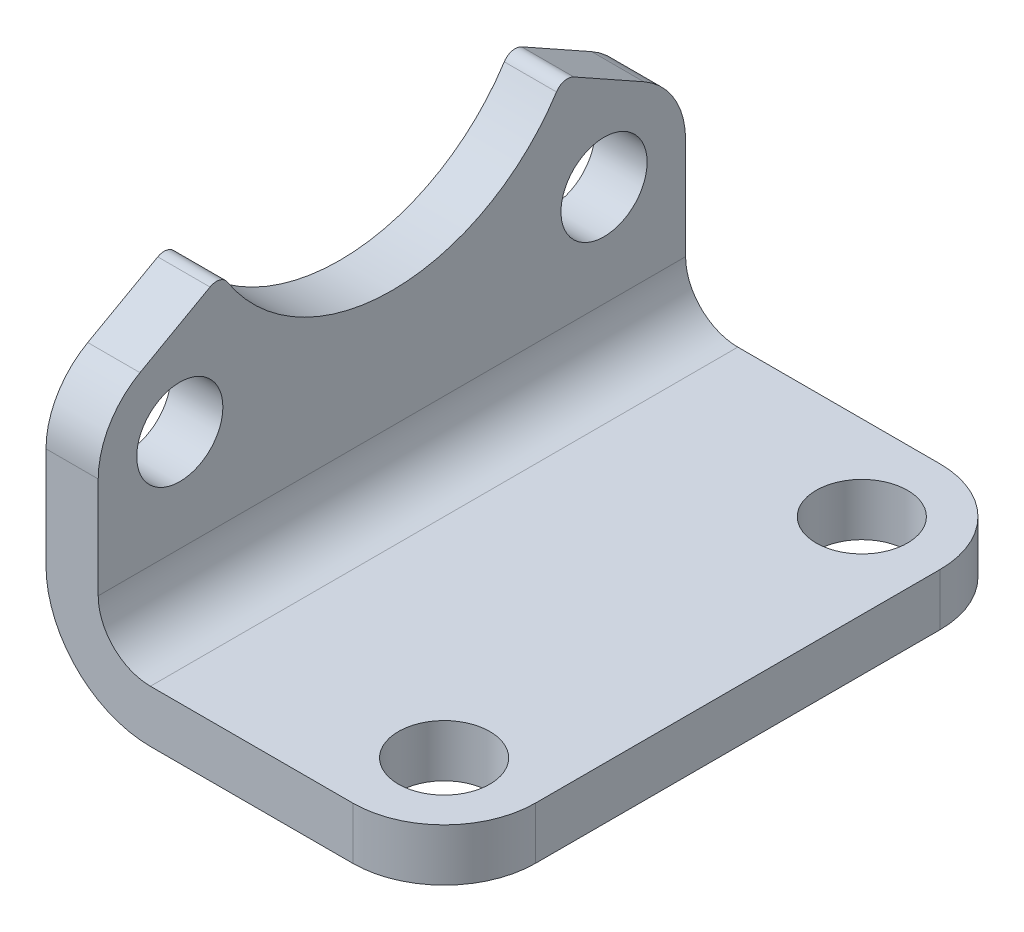
ISO-10303-21;
HEADER;
FILE_DESCRIPTION(('STEP AP214'),'2;1');
FILE_NAME('part.step','',(''),(''),'','','');
FILE_SCHEMA(('AUTOMOTIVE_DESIGN { 1 0 10303 214 1 1 1 1 }'));
ENDSEC;
DATA;
#1=APPLICATION_CONTEXT('core data for automotive mechanical design processes');
#2=APPLICATION_PROTOCOL_DEFINITION('international standard','automotive_design',2000,#1);
#3=PRODUCT_CONTEXT('',#1,'mechanical');
#4=PRODUCT('Part','Part','',(#3));
#5=PRODUCT_RELATED_PRODUCT_CATEGORY('part','',(#4));
#6=PRODUCT_DEFINITION_FORMATION('','',#4);
#7=PRODUCT_DEFINITION_CONTEXT('part definition',#1,'design');
#8=PRODUCT_DEFINITION('design','',#6,#7);
#9=PRODUCT_DEFINITION_SHAPE('','',#8);
#10=(LENGTH_UNIT() NAMED_UNIT(*) SI_UNIT(.MILLI.,.METRE.));
#11=(NAMED_UNIT(*) PLANE_ANGLE_UNIT() SI_UNIT($,.RADIAN.));
#12=(NAMED_UNIT(*) SI_UNIT($,.STERADIAN.) SOLID_ANGLE_UNIT());
#13=UNCERTAINTY_MEASURE_WITH_UNIT(LENGTH_MEASURE(1.E-05),#10,'distance_accuracy_value','');
#14=(GEOMETRIC_REPRESENTATION_CONTEXT(3) GLOBAL_UNCERTAINTY_ASSIGNED_CONTEXT((#13)) GLOBAL_UNIT_ASSIGNED_CONTEXT((#10,
#11,#12)) REPRESENTATION_CONTEXT('',''));
#15=CARTESIAN_POINT('',(0.,0.,0.));
#16=DIRECTION('',(0.,0.,1.));
#17=DIRECTION('',(1.,0.,0.));
#18=AXIS2_PLACEMENT_3D('',#15,#16,#17);
#19=CARTESIAN_POINT('',(5.,-8.66783443079967,-13.4487414385229));
#20=DIRECTION('',(1.,0.,0.));
#21=DIRECTION('',(0.,0.,-1.));
#22=AXIS2_PLACEMENT_3D('',#19,#20,#21);
#23=CYLINDRICAL_SURFACE('',#22,1.);
#24=DIRECTION('',(1.,0.,0.));
#25=VECTOR('',#24,1.);
#26=CARTESIAN_POINT('',(5.,-7.79507266107068,-13.9368878236366));
#27=LINE('',#26,#25);
#28=CARTESIAN_POINT('',(4.,-7.79507266107065,-13.9368878236366));
#29=VERTEX_POINT('',#28);
#30=CARTESIAN_POINT('',(0.,-7.79507266107065,-13.9368878236366));
#31=VERTEX_POINT('',#30);
#32=EDGE_CURVE('E131',#29,#31,#27,.F.);
#33=ORIENTED_EDGE('',*,*,#32,.T.);
#34=CARTESIAN_POINT('',(0.,-8.66783443079967,-13.4487414385229));
#35=DIRECTION('',(1.,0.,0.));
#36=DIRECTION('',(0.,0.,-1.));
#37=AXIS2_PLACEMENT_3D('',#34,#35,#36);
#38=CIRCLE('',#37,1.);
#39=CARTESIAN_POINT('',(0.,-8.1260947546199,-12.6081951142477));
#40=VERTEX_POINT('',#39);
#41=EDGE_CURVE('E136',#31,#40,#38,.T.);
#42=ORIENTED_EDGE('',*,*,#41,.T.);
#43=DIRECTION('',(1.,0.,0.));
#44=VECTOR('',#43,1.);
#45=CARTESIAN_POINT('',(5.,-8.12609473036512,-12.6081951298801));
#46=LINE('',#45,#44);
#47=CARTESIAN_POINT('',(4.,-8.1260947546199,-12.6081951142477));
#48=VERTEX_POINT('',#47);
#49=EDGE_CURVE('E134',#40,#48,#46,.T.);
#50=ORIENTED_EDGE('',*,*,#49,.T.);
#51=CARTESIAN_POINT('',(4.,-8.66783443079967,-13.4487414385229));
#52=DIRECTION('',(1.,0.,0.));
#53=DIRECTION('',(0.,0.,-1.));
#54=AXIS2_PLACEMENT_3D('',#51,#52,#53);
#55=CIRCLE('',#54,1.);
#56=EDGE_CURVE('E19',#48,#29,#55,.F.);
#57=ORIENTED_EDGE('',*,*,#56,.T.);
#58=EDGE_LOOP('',(#33,#42,#50,#57));
#59=FACE_BOUND('',#58,.T.);
#60=ADVANCED_FACE('F16',(#59),#23,.T.);
#61=CARTESIAN_POINT('',(5.,-8.66783443079967,13.4487414385229));
#62=DIRECTION('',(1.,0.,0.));
#63=DIRECTION('',(0.,0.,-1.));
#64=AXIS2_PLACEMENT_3D('',#61,#62,#63);
#65=CYLINDRICAL_SURFACE('',#64,1.);
#66=DIRECTION('',(1.,0.,0.));
#67=VECTOR('',#66,1.);
#68=CARTESIAN_POINT('',(5.,-8.12609477887466,12.6081950986153));
#69=LINE('',#68,#67);
#70=CARTESIAN_POINT('',(4.,-8.12609477887468,12.6081950986152));
#71=VERTEX_POINT('',#70);
#72=CARTESIAN_POINT('',(0.,-8.12609477887468,12.6081950986152));
#73=VERTEX_POINT('',#72);
#74=EDGE_CURVE('E180',#71,#73,#69,.F.);
#75=ORIENTED_EDGE('',*,*,#74,.T.);
#76=CARTESIAN_POINT('',(0.,-8.66783443079967,13.4487414385229));
#77=DIRECTION('',(1.,0.,0.));
#78=DIRECTION('',(0.,0.,-1.));
#79=AXIS2_PLACEMENT_3D('',#76,#77,#78);
#80=CIRCLE('',#79,1.);
#81=CARTESIAN_POINT('',(0.,-7.79507266107064,13.9368878236366));
#82=VERTEX_POINT('',#81);
#83=EDGE_CURVE('E144',#73,#82,#80,.T.);
#84=ORIENTED_EDGE('',*,*,#83,.T.);
#85=DIRECTION('',(1.,0.,0.));
#86=VECTOR('',#85,1.);
#87=CARTESIAN_POINT('',(5.,-7.79507266107066,13.9368878236366));
#88=LINE('',#87,#86);
#89=CARTESIAN_POINT('',(4.,-7.79507266107064,13.9368878236366));
#90=VERTEX_POINT('',#89);
#91=EDGE_CURVE('E177',#82,#90,#88,.T.);
#92=ORIENTED_EDGE('',*,*,#91,.T.);
#93=CARTESIAN_POINT('',(4.,-8.66783443079967,13.4487414385229));
#94=DIRECTION('',(1.,0.,0.));
#95=DIRECTION('',(0.,0.,-1.));
#96=AXIS2_PLACEMENT_3D('',#93,#94,#95);
#97=CIRCLE('',#96,1.);
#98=EDGE_CURVE('E250',#90,#71,#97,.F.);
#99=ORIENTED_EDGE('',*,*,#98,.T.);
#100=EDGE_LOOP('',(#75,#84,#92,#99));
#101=FACE_BOUND('',#100,.T.);
#102=ADVANCED_FACE('F263',(#101),#65,.T.);
#103=CARTESIAN_POINT('',(5.,-16.25,-16.25));
#104=DIRECTION('',(1.,0.,0.));
#105=DIRECTION('',(0.,0.,-1.));
#106=AXIS2_PLACEMENT_3D('',#103,#104,#105);
#107=CYLINDRICAL_SURFACE('',#106,3.3);
#108=CARTESIAN_POINT('',(0.,-16.25,-16.25));
#109=DIRECTION('',(1.,0.,0.));
#110=DIRECTION('',(0.,0.,-1.));
#111=AXIS2_PLACEMENT_3D('',#108,#109,#110);
#112=CIRCLE('',#111,3.3);
#113=CARTESIAN_POINT('',(0.,-16.25,-19.55));
#114=VERTEX_POINT('',#113);
#115=EDGE_CURVE('E239',#114,#114,#112,.F.);
#116=ORIENTED_EDGE('',*,*,#115,.T.);
#117=EDGE_LOOP('',(#116));
#118=FACE_BOUND('',#117,.T.);
#119=CARTESIAN_POINT('',(4.,-16.25,-16.25));
#120=DIRECTION('',(1.,0.,0.));
#121=DIRECTION('',(0.,0.,-1.));
#122=AXIS2_PLACEMENT_3D('',#119,#120,#121);
#123=CIRCLE('',#122,3.3);
#124=CARTESIAN_POINT('',(4.,-16.25,-19.55));
#125=VERTEX_POINT('',#124);
#126=EDGE_CURVE('E165',#125,#125,#123,.T.);
#127=ORIENTED_EDGE('',*,*,#126,.T.);
#128=EDGE_LOOP('',(#127));
#129=FACE_BOUND('',#128,.T.);
#130=ADVANCED_FACE('F392',(#118,#129),#107,.F.);
#131=CARTESIAN_POINT('',(5.,-16.25,16.25));
#132=DIRECTION('',(1.,0.,0.));
#133=DIRECTION('',(0.,0.,-1.));
#134=AXIS2_PLACEMENT_3D('',#131,#132,#133);
#135=CYLINDRICAL_SURFACE('',#134,3.3);
#136=CARTESIAN_POINT('',(0.,-16.25,16.25));
#137=DIRECTION('',(1.,0.,0.));
#138=DIRECTION('',(0.,0.,-1.));
#139=AXIS2_PLACEMENT_3D('',#136,#137,#138);
#140=CIRCLE('',#139,3.3);
#141=CARTESIAN_POINT('',(0.,-16.25,12.95));
#142=VERTEX_POINT('',#141);
#143=EDGE_CURVE('E236',#142,#142,#140,.F.);
#144=ORIENTED_EDGE('',*,*,#143,.T.);
#145=EDGE_LOOP('',(#144));
#146=FACE_BOUND('',#145,.T.);
#147=CARTESIAN_POINT('',(4.,-16.25,16.25));
#148=DIRECTION('',(1.,0.,0.));
#149=DIRECTION('',(0.,0.,-1.));
#150=AXIS2_PLACEMENT_3D('',#147,#148,#149);
#151=CIRCLE('',#150,3.3);
#152=CARTESIAN_POINT('',(4.,-16.25,12.95));
#153=VERTEX_POINT('',#152);
#154=EDGE_CURVE('E156',#153,#153,#151,.T.);
#155=ORIENTED_EDGE('',*,*,#154,.T.);
#156=EDGE_LOOP('',(#155));
#157=FACE_BOUND('',#156,.T.);
#158=ADVANCED_FACE('F389',(#146,#157),#135,.F.);
#159=CARTESIAN_POINT('',(5.,-10.7952389391937,-19.3009149069601));
#160=DIRECTION('',(0.,-0.872761769729005,0.488146385113621));
#161=DIRECTION('',(0.,-0.488146385113621,-0.872761769729005));
#162=AXIS2_PLACEMENT_3D('',#159,#160,#161);
#163=PLANE('',#162);
#164=DIRECTION('',(0.,-0.488146385113624,-0.872761769729003));
#165=VECTOR('',#164,1.);
#166=CARTESIAN_POINT('',(4.,-7.79507266107066,-13.9368878236366));
#167=LINE('',#166,#165);
#168=CARTESIAN_POINT('',(4.,-10.7952389391937,-19.3009149069601));
#169=VERTEX_POINT('',#168);
#170=EDGE_CURVE('E140',#29,#169,#167,.T.);
#171=ORIENTED_EDGE('',*,*,#170,.T.);
#172=DIRECTION('',(1.,0.,0.));
#173=VECTOR('',#172,1.);
#174=CARTESIAN_POINT('',(5.,-10.7952389391937,-19.3009149069601));
#175=LINE('',#174,#173);
#176=CARTESIAN_POINT('',(0.,-10.7952389391937,-19.3009149069601));
#177=VERTEX_POINT('',#176);
#178=EDGE_CURVE('E184',#177,#169,#175,.T.);
#179=ORIENTED_EDGE('',*,*,#178,.F.);
#180=DIRECTION('',(0.,0.488146385113624,0.872761769729003));
#181=VECTOR('',#180,1.);
#182=CARTESIAN_POINT('',(0.,-10.7952389391937,-19.3009149069601));
#183=LINE('',#182,#181);
#184=EDGE_CURVE('E143',#177,#31,#183,.T.);
#185=ORIENTED_EDGE('',*,*,#184,.T.);
#186=ORIENTED_EDGE('',*,*,#32,.F.);
#187=EDGE_LOOP('',(#171,#179,#185,#186));
#188=FACE_BOUND('',#187,.T.);
#189=ADVANCED_FACE('F139',(#188),#163,.F.);
#190=CARTESIAN_POINT('',(5.,0.,0.));
#191=DIRECTION('',(1.,0.,0.));
#192=DIRECTION('',(0.,0.,-1.));
#193=AXIS2_PLACEMENT_3D('',#190,#191,#192);
#194=CYLINDRICAL_SURFACE('',#193,15.);
#195=ORIENTED_EDGE('',*,*,#74,.F.);
#196=CARTESIAN_POINT('',(4.,0.,0.));
#197=DIRECTION('',(1.,0.,0.));
#198=DIRECTION('',(0.,0.,-1.));
#199=AXIS2_PLACEMENT_3D('',#196,#197,#198);
#200=CIRCLE('',#199,15.);
#201=EDGE_CURVE('E151',#71,#48,#200,.T.);
#202=ORIENTED_EDGE('',*,*,#201,.T.);
#203=ORIENTED_EDGE('',*,*,#49,.F.);
#204=CARTESIAN_POINT('',(0.,0.,0.));
#205=DIRECTION('',(1.,0.,0.));
#206=DIRECTION('',(0.,0.,-1.));
#207=AXIS2_PLACEMENT_3D('',#204,#205,#206);
#208=CIRCLE('',#207,15.);
#209=EDGE_CURVE('E230',#40,#73,#208,.F.);
#210=ORIENTED_EDGE('',*,*,#209,.T.);
#211=EDGE_LOOP('',(#195,#202,#203,#210));
#212=FACE_BOUND('',#211,.T.);
#213=ADVANCED_FACE('F255',(#212),#194,.F.);
#214=CARTESIAN_POINT('',(5.,-7.79507266107066,13.9368878236366));
#215=DIRECTION('',(0.,-0.872761769729005,-0.488146385113621));
#216=DIRECTION('',(0.,0.488146385113621,-0.872761769729005));
#217=AXIS2_PLACEMENT_3D('',#214,#215,#216);
#218=PLANE('',#217);
#219=DIRECTION('',(0.,0.488146385113624,-0.872761769729003));
#220=VECTOR('',#219,1.);
#221=CARTESIAN_POINT('',(4.,-10.7952389391937,19.3009149069601));
#222=LINE('',#221,#220);
#223=CARTESIAN_POINT('',(4.,-10.7952389391937,19.3009149069601));
#224=VERTEX_POINT('',#223);
#225=EDGE_CURVE('E159',#224,#90,#222,.T.);
#226=ORIENTED_EDGE('',*,*,#225,.T.);
#227=ORIENTED_EDGE('',*,*,#91,.F.);
#228=DIRECTION('',(0.,-0.488146385113624,0.872761769729003));
#229=VECTOR('',#228,1.);
#230=CARTESIAN_POINT('',(0.,-7.79507266107066,13.9368878236366));
#231=LINE('',#230,#229);
#232=CARTESIAN_POINT('',(0.,-10.7952389391937,19.3009149069601));
#233=VERTEX_POINT('',#232);
#234=EDGE_CURVE('E229',#82,#233,#231,.T.);
#235=ORIENTED_EDGE('',*,*,#234,.T.);
#236=DIRECTION('',(1.,0.,0.));
#237=VECTOR('',#236,1.);
#238=CARTESIAN_POINT('',(5.,-10.7952389391937,19.3009149069601));
#239=LINE('',#238,#237);
#240=EDGE_CURVE('E166',#224,#233,#239,.F.);
#241=ORIENTED_EDGE('',*,*,#240,.F.);
#242=EDGE_LOOP('',(#226,#227,#235,#241));
#243=FACE_BOUND('',#242,.T.);
#244=ADVANCED_FACE('F267',(#243),#218,.F.);
#245=CARTESIAN_POINT('',(5.,-16.25,16.25));
#246=DIRECTION('',(1.,0.,0.));
#247=DIRECTION('',(0.,0.,-1.));
#248=AXIS2_PLACEMENT_3D('',#245,#246,#247);
#249=CYLINDRICAL_SURFACE('',#248,6.24999999999999);
#250=ORIENTED_EDGE('',*,*,#240,.T.);
#251=CARTESIAN_POINT('',(0.,-16.25,16.25));
#252=DIRECTION('',(1.,0.,0.));
#253=DIRECTION('',(0.,0.,-1.));
#254=AXIS2_PLACEMENT_3D('',#251,#252,#253);
#255=CIRCLE('',#254,6.24999999999999);
#256=CARTESIAN_POINT('',(0.,-16.25,22.5));
#257=VERTEX_POINT('',#256);
#258=EDGE_CURVE('E226',#233,#257,#255,.T.);
#259=ORIENTED_EDGE('',*,*,#258,.T.);
#260=DIRECTION('',(1.,0.,0.));
#261=VECTOR('',#260,1.);
#262=CARTESIAN_POINT('',(8.,-16.25,22.5));
#263=LINE('',#262,#261);
#264=CARTESIAN_POINT('',(4.,-16.25,22.5));
#265=VERTEX_POINT('',#264);
#266=EDGE_CURVE('E172',#265,#257,#263,.F.);
#267=ORIENTED_EDGE('',*,*,#266,.F.);
#268=CARTESIAN_POINT('',(4.,-16.25,16.25));
#269=DIRECTION('',(1.,0.,0.));
#270=DIRECTION('',(0.,0.,-1.));
#271=AXIS2_PLACEMENT_3D('',#268,#269,#270);
#272=CIRCLE('',#271,6.24999999999999);
#273=EDGE_CURVE('E154',#265,#224,#272,.F.);
#274=ORIENTED_EDGE('',*,*,#273,.T.);
#275=EDGE_LOOP('',(#250,#259,#267,#274));
#276=FACE_BOUND('',#275,.T.);
#277=ADVANCED_FACE('F269',(#276),#249,.T.);
#278=CARTESIAN_POINT('',(30.5,-28.,22.5));
#279=DIRECTION('',(0.,-1.,0.));
#280=DIRECTION('',(0.,0.,-1.));
#281=AXIS2_PLACEMENT_3D('',#278,#279,#280);
#282=PLANE('',#281);
#283=CARTESIAN_POINT('',(23.5,-28.,-15.5));
#284=DIRECTION('',(0.,1.,0.));
#285=DIRECTION('',(0.,0.,1.));
#286=AXIS2_PLACEMENT_3D('',#283,#284,#285);
#287=CIRCLE('',#286,7.00000000000001);
#288=CARTESIAN_POINT('',(23.5,-28.,-22.5));
#289=VERTEX_POINT('',#288);
#290=CARTESIAN_POINT('',(30.5,-28.,-15.500000052154));
#291=VERTEX_POINT('',#290);
#292=EDGE_CURVE('E170',#289,#291,#287,.F.);
#293=ORIENTED_EDGE('',*,*,#292,.F.);
#294=DIRECTION('',(1.,0.,0.));
#295=VECTOR('',#294,1.);
#296=CARTESIAN_POINT('',(8.,-28.,-22.5));
#297=LINE('',#296,#295);
#298=CARTESIAN_POINT('',(8.,-28.,-22.5));
#299=VERTEX_POINT('',#298);
#300=EDGE_CURVE('E208',#289,#299,#297,.F.);
#301=ORIENTED_EDGE('',*,*,#300,.T.);
#302=DIRECTION('',(0.,0.,1.));
#303=VECTOR('',#302,1.);
#304=CARTESIAN_POINT('',(8.,-28.,22.5));
#305=LINE('',#304,#303);
#306=CARTESIAN_POINT('',(8.,-28.,22.5));
#307=VERTEX_POINT('',#306);
#308=EDGE_CURVE('E162',#299,#307,#305,.T.);
#309=ORIENTED_EDGE('',*,*,#308,.T.);
#310=DIRECTION('',(1.,0.,0.));
#311=VECTOR('',#310,1.);
#312=CARTESIAN_POINT('',(8.,-28.,22.5));
#313=LINE('',#312,#311);
#314=CARTESIAN_POINT('',(23.5,-28.,22.5));
#315=VERTEX_POINT('',#314);
#316=EDGE_CURVE('E218',#315,#307,#313,.F.);
#317=ORIENTED_EDGE('',*,*,#316,.F.);
#318=CARTESIAN_POINT('',(23.5,-28.,15.5));
#319=DIRECTION('',(0.,1.,0.));
#320=DIRECTION('',(0.,0.,1.));
#321=AXIS2_PLACEMENT_3D('',#318,#319,#320);
#322=CIRCLE('',#321,7.00000000000001);
#323=CARTESIAN_POINT('',(30.5,-28.,15.5));
#324=VERTEX_POINT('',#323);
#325=EDGE_CURVE('E211',#324,#315,#322,.F.);
#326=ORIENTED_EDGE('',*,*,#325,.F.);
#327=DIRECTION('',(0.,0.,1.));
#328=VECTOR('',#327,1.);
#329=CARTESIAN_POINT('',(30.5,-28.,22.5));
#330=LINE('',#329,#328);
#331=EDGE_CURVE('E167',#324,#291,#330,.F.);
#332=ORIENTED_EDGE('',*,*,#331,.T.);
#333=EDGE_LOOP('',(#293,#301,#309,#317,#326,#332));
#334=FACE_BOUND('',#333,.T.);
#335=CARTESIAN_POINT('',(24.,-28.,-16.));
#336=DIRECTION('',(0.,1.,0.));
#337=DIRECTION('',(0.,0.,1.));
#338=AXIS2_PLACEMENT_3D('',#335,#336,#337);
#339=CIRCLE('',#338,3.5);
#340=CARTESIAN_POINT('',(24.,-28.,-12.5));
#341=VERTEX_POINT('',#340);
#342=EDGE_CURVE('E219',#341,#341,#339,.F.);
#343=ORIENTED_EDGE('',*,*,#342,.T.);
#344=EDGE_LOOP('',(#343));
#345=FACE_BOUND('',#344,.T.);
#346=CARTESIAN_POINT('',(24.,-28.,16.));
#347=DIRECTION('',(0.,1.,0.));
#348=DIRECTION('',(0.,0.,1.));
#349=AXIS2_PLACEMENT_3D('',#346,#347,#348);
#350=CIRCLE('',#349,3.5);
#351=CARTESIAN_POINT('',(24.,-28.,19.5));
#352=VERTEX_POINT('',#351);
#353=EDGE_CURVE('E223',#352,#352,#350,.F.);
#354=ORIENTED_EDGE('',*,*,#353,.T.);
#355=EDGE_LOOP('',(#354));
#356=FACE_BOUND('',#355,.T.);
#357=ADVANCED_FACE('F320',(#334,#345,#356),#282,.F.);
#358=CARTESIAN_POINT('',(8.,-24.,22.5));
#359=DIRECTION('',(0.,0.,1.));
#360=DIRECTION('',(1.,0.,0.));
#361=AXIS2_PLACEMENT_3D('',#358,#359,#360);
#362=CYLINDRICAL_SURFACE('',#361,4.);
#363=DIRECTION('',(0.,0.,1.));
#364=VECTOR('',#363,1.);
#365=CARTESIAN_POINT('',(4.,-24.,22.5));
#366=LINE('',#365,#364);
#367=CARTESIAN_POINT('',(4.,-24.,-22.5));
#368=VERTEX_POINT('',#367);
#369=CARTESIAN_POINT('',(4.,-24.,22.5));
#370=VERTEX_POINT('',#369);
#371=EDGE_CURVE('E150',#368,#370,#366,.T.);
#372=ORIENTED_EDGE('',*,*,#371,.T.);
#373=CARTESIAN_POINT('',(8.,-24.,22.5));
#374=DIRECTION('',(0.,0.,1.));
#375=DIRECTION('',(1.,0.,0.));
#376=AXIS2_PLACEMENT_3D('',#373,#374,#375);
#377=CIRCLE('',#376,4.);
#378=EDGE_CURVE('E216',#307,#370,#377,.F.);
#379=ORIENTED_EDGE('',*,*,#378,.F.);
#380=ORIENTED_EDGE('',*,*,#308,.F.);
#381=CARTESIAN_POINT('',(8.,-24.,-22.5));
#382=DIRECTION('',(0.,0.,1.));
#383=DIRECTION('',(1.,0.,0.));
#384=AXIS2_PLACEMENT_3D('',#381,#382,#383);
#385=CIRCLE('',#384,4.);
#386=EDGE_CURVE('E204',#299,#368,#385,.F.);
#387=ORIENTED_EDGE('',*,*,#386,.T.);
#388=EDGE_LOOP('',(#372,#379,#380,#387));
#389=FACE_BOUND('',#388,.T.);
#390=ADVANCED_FACE('F325',(#389),#362,.F.);
#391=CARTESIAN_POINT('',(4.,-24.,22.5));
#392=DIRECTION('',(-1.,0.,0.));
#393=DIRECTION('',(0.,0.,1.));
#394=AXIS2_PLACEMENT_3D('',#391,#392,#393);
#395=PLANE('',#394);
#396=ORIENTED_EDGE('',*,*,#273,.F.);
#397=DIRECTION('',(0.,1.,0.));
#398=VECTOR('',#397,1.);
#399=CARTESIAN_POINT('',(4.,-24.,22.5));
#400=LINE('',#399,#398);
#401=EDGE_CURVE('E175',#370,#265,#400,.T.);
#402=ORIENTED_EDGE('',*,*,#401,.F.);
#403=ORIENTED_EDGE('',*,*,#371,.F.);
#404=DIRECTION('',(0.,1.,0.));
#405=VECTOR('',#404,1.);
#406=CARTESIAN_POINT('',(4.,-24.,-22.5));
#407=LINE('',#406,#405);
#408=CARTESIAN_POINT('',(4.,-16.25,-22.5));
#409=VERTEX_POINT('',#408);
#410=EDGE_CURVE('E207',#368,#409,#407,.T.);
#411=ORIENTED_EDGE('',*,*,#410,.T.);
#412=CARTESIAN_POINT('',(4.,-16.25,-16.25));
#413=DIRECTION('',(1.,0.,0.));
#414=DIRECTION('',(0.,0.,-1.));
#415=AXIS2_PLACEMENT_3D('',#412,#413,#414);
#416=CIRCLE('',#415,6.24999999999999);
#417=EDGE_CURVE('E149',#169,#409,#416,.F.);
#418=ORIENTED_EDGE('',*,*,#417,.F.);
#419=ORIENTED_EDGE('',*,*,#170,.F.);
#420=ORIENTED_EDGE('',*,*,#56,.F.);
#421=ORIENTED_EDGE('',*,*,#201,.F.);
#422=ORIENTED_EDGE('',*,*,#98,.F.);
#423=ORIENTED_EDGE('',*,*,#225,.F.);
#424=EDGE_LOOP('',(#396,#402,#403,#411,#418,#419,#420,#421,#422,#423));
#425=FACE_BOUND('',#424,.T.);
#426=ORIENTED_EDGE('',*,*,#154,.F.);
#427=EDGE_LOOP('',(#426));
#428=FACE_BOUND('',#427,.T.);
#429=ORIENTED_EDGE('',*,*,#126,.F.);
#430=EDGE_LOOP('',(#429));
#431=FACE_BOUND('',#430,.T.);
#432=ADVANCED_FACE('F146',(#425,#428,#431),#395,.F.);
#433=CARTESIAN_POINT('',(5.,-16.25,-16.25));
#434=DIRECTION('',(1.,0.,0.));
#435=DIRECTION('',(0.,0.,-1.));
#436=AXIS2_PLACEMENT_3D('',#433,#434,#435);
#437=CYLINDRICAL_SURFACE('',#436,6.24999999999999);
#438=DIRECTION('',(1.,0.,0.));
#439=VECTOR('',#438,1.);
#440=CARTESIAN_POINT('',(8.,-16.25,-22.5));
#441=LINE('',#440,#439);
#442=CARTESIAN_POINT('',(0.,-16.25,-22.5));
#443=VERTEX_POINT('',#442);
#444=EDGE_CURVE('E285',#409,#443,#441,.F.);
#445=ORIENTED_EDGE('',*,*,#444,.T.);
#446=CARTESIAN_POINT('',(0.,-16.25,-16.25));
#447=DIRECTION('',(1.,0.,0.));
#448=DIRECTION('',(0.,0.,-1.));
#449=AXIS2_PLACEMENT_3D('',#446,#447,#448);
#450=CIRCLE('',#449,6.24999999999999);
#451=EDGE_CURVE('E233',#443,#177,#450,.T.);
#452=ORIENTED_EDGE('',*,*,#451,.T.);
#453=ORIENTED_EDGE('',*,*,#178,.T.);
#454=ORIENTED_EDGE('',*,*,#417,.T.);
#455=EDGE_LOOP('',(#445,#452,#453,#454));
#456=FACE_BOUND('',#455,.T.);
#457=ADVANCED_FACE('F330',(#456),#437,.T.);
#458=CARTESIAN_POINT('',(0.,-1.,22.5));
#459=DIRECTION('',(1.,0.,0.));
#460=DIRECTION('',(0.,0.,-1.));
#461=AXIS2_PLACEMENT_3D('',#458,#459,#460);
#462=PLANE('',#461);
#463=ORIENTED_EDGE('',*,*,#258,.F.);
#464=ORIENTED_EDGE('',*,*,#234,.F.);
#465=ORIENTED_EDGE('',*,*,#83,.F.);
#466=ORIENTED_EDGE('',*,*,#209,.F.);
#467=ORIENTED_EDGE('',*,*,#41,.F.);
#468=ORIENTED_EDGE('',*,*,#184,.F.);
#469=ORIENTED_EDGE('',*,*,#451,.F.);
#470=DIRECTION('',(0.,1.,0.));
#471=VECTOR('',#470,1.);
#472=CARTESIAN_POINT('',(0.,-24.,-22.5));
#473=LINE('',#472,#471);
#474=CARTESIAN_POINT('',(0.,-24.,-22.5));
#475=VERTEX_POINT('',#474);
#476=EDGE_CURVE('E203',#443,#475,#473,.F.);
#477=ORIENTED_EDGE('',*,*,#476,.T.);
#478=DIRECTION('',(0.,0.,1.));
#479=VECTOR('',#478,1.);
#480=CARTESIAN_POINT('',(0.,-24.,22.5));
#481=LINE('',#480,#479);
#482=CARTESIAN_POINT('',(0.,-24.,22.5));
#483=VERTEX_POINT('',#482);
#484=EDGE_CURVE('E222',#483,#475,#481,.F.);
#485=ORIENTED_EDGE('',*,*,#484,.F.);
#486=DIRECTION('',(0.,1.,0.));
#487=VECTOR('',#486,1.);
#488=CARTESIAN_POINT('',(0.,-24.,22.5));
#489=LINE('',#488,#487);
#490=EDGE_CURVE('E174',#257,#483,#489,.F.);
#491=ORIENTED_EDGE('',*,*,#490,.F.);
#492=EDGE_LOOP('',(#463,#464,#465,#466,#467,#468,#469,#477,#485,#491));
#493=FACE_BOUND('',#492,.T.);
#494=ORIENTED_EDGE('',*,*,#143,.F.);
#495=EDGE_LOOP('',(#494));
#496=FACE_BOUND('',#495,.T.);
#497=ORIENTED_EDGE('',*,*,#115,.F.);
#498=EDGE_LOOP('',(#497));
#499=FACE_BOUND('',#498,.T.);
#500=ADVANCED_FACE('F257',(#493,#496,#499),#462,.F.);
#501=CARTESIAN_POINT('',(24.,33.,16.));
#502=DIRECTION('',(0.,1.,0.));
#503=DIRECTION('',(0.,0.,1.));
#504=AXIS2_PLACEMENT_3D('',#501,#502,#503);
#505=CYLINDRICAL_SURFACE('',#504,3.5);
#506=CARTESIAN_POINT('',(24.,-32.,16.));
#507=DIRECTION('',(0.,1.,0.));
#508=DIRECTION('',(0.,0.,1.));
#509=AXIS2_PLACEMENT_3D('',#506,#507,#508);
#510=CIRCLE('',#509,3.5);
#511=CARTESIAN_POINT('',(24.,-32.,19.5));
#512=VERTEX_POINT('',#511);
#513=EDGE_CURVE('E197',#512,#512,#510,.F.);
#514=ORIENTED_EDGE('',*,*,#513,.T.);
#515=EDGE_LOOP('',(#514));
#516=FACE_BOUND('',#515,.T.);
#517=ORIENTED_EDGE('',*,*,#353,.F.);
#518=EDGE_LOOP('',(#517));
#519=FACE_BOUND('',#518,.T.);
#520=ADVANCED_FACE('F338',(#516,#519),#505,.F.);
#521=CARTESIAN_POINT('',(24.,33.,-16.));
#522=DIRECTION('',(0.,1.,0.));
#523=DIRECTION('',(0.,0.,1.));
#524=AXIS2_PLACEMENT_3D('',#521,#522,#523);
#525=CYLINDRICAL_SURFACE('',#524,3.5);
#526=CARTESIAN_POINT('',(24.,-32.,-16.));
#527=DIRECTION('',(0.,1.,0.));
#528=DIRECTION('',(0.,0.,1.));
#529=AXIS2_PLACEMENT_3D('',#526,#527,#528);
#530=CIRCLE('',#529,3.5);
#531=CARTESIAN_POINT('',(24.,-32.,-12.5));
#532=VERTEX_POINT('',#531);
#533=EDGE_CURVE('E193',#532,#532,#530,.F.);
#534=ORIENTED_EDGE('',*,*,#533,.T.);
#535=EDGE_LOOP('',(#534));
#536=FACE_BOUND('',#535,.T.);
#537=ORIENTED_EDGE('',*,*,#342,.F.);
#538=EDGE_LOOP('',(#537));
#539=FACE_BOUND('',#538,.T.);
#540=ADVANCED_FACE('F361',(#536,#539),#525,.F.);
#541=CARTESIAN_POINT('',(8.,-24.,22.5));
#542=DIRECTION('',(0.,0.,1.));
#543=DIRECTION('',(1.,0.,0.));
#544=AXIS2_PLACEMENT_3D('',#541,#542,#543);
#545=CYLINDRICAL_SURFACE('',#544,8.);
#546=CARTESIAN_POINT('',(8.,-24.,22.5));
#547=DIRECTION('',(0.,0.,1.));
#548=DIRECTION('',(1.,0.,0.));
#549=AXIS2_PLACEMENT_3D('',#546,#547,#548);
#550=CIRCLE('',#549,8.);
#551=CARTESIAN_POINT('',(7.99999999999999,-32.,22.5));
#552=VERTEX_POINT('',#551);
#553=EDGE_CURVE('E214',#483,#552,#550,.T.);
#554=ORIENTED_EDGE('',*,*,#553,.F.);
#555=ORIENTED_EDGE('',*,*,#484,.T.);
#556=CARTESIAN_POINT('',(8.,-24.,-22.5));
#557=DIRECTION('',(0.,0.,1.));
#558=DIRECTION('',(1.,0.,0.));
#559=AXIS2_PLACEMENT_3D('',#556,#557,#558);
#560=CIRCLE('',#559,8.);
#561=CARTESIAN_POINT('',(7.99999999999999,-32.,-22.5));
#562=VERTEX_POINT('',#561);
#563=EDGE_CURVE('E200',#475,#562,#560,.T.);
#564=ORIENTED_EDGE('',*,*,#563,.T.);
#565=DIRECTION('',(0.,0.,1.));
#566=VECTOR('',#565,1.);
#567=CARTESIAN_POINT('',(7.99999999999999,-32.,22.5));
#568=LINE('',#567,#566);
#569=EDGE_CURVE('E196',#562,#552,#568,.T.);
#570=ORIENTED_EDGE('',*,*,#569,.T.);
#571=EDGE_LOOP('',(#554,#555,#564,#570));
#572=FACE_BOUND('',#571,.T.);
#573=ADVANCED_FACE('F358',(#572),#545,.T.);
#574=CARTESIAN_POINT('',(8.,-24.,22.5));
#575=DIRECTION('',(0.,0.,1.));
#576=DIRECTION('',(1.,0.,0.));
#577=AXIS2_PLACEMENT_3D('',#574,#575,#576);
#578=PLANE('',#577);
#579=DIRECTION('',(1.,0.,0.));
#580=VECTOR('',#579,1.);
#581=CARTESIAN_POINT('',(8.,-32.,22.5));
#582=LINE('',#581,#580);
#583=CARTESIAN_POINT('',(23.5,-32.,22.5));
#584=VERTEX_POINT('',#583);
#585=EDGE_CURVE('E192',#552,#584,#582,.T.);
#586=ORIENTED_EDGE('',*,*,#585,.T.);
#587=DIRECTION('',(0.,1.,0.));
#588=VECTOR('',#587,1.);
#589=CARTESIAN_POINT('',(23.5,33.,22.5));
#590=LINE('',#589,#588);
#591=EDGE_CURVE('E213',#315,#584,#590,.F.);
#592=ORIENTED_EDGE('',*,*,#591,.F.);
#593=ORIENTED_EDGE('',*,*,#316,.T.);
#594=ORIENTED_EDGE('',*,*,#378,.T.);
#595=ORIENTED_EDGE('',*,*,#401,.T.);
#596=ORIENTED_EDGE('',*,*,#266,.T.);
#597=ORIENTED_EDGE('',*,*,#490,.T.);
#598=ORIENTED_EDGE('',*,*,#553,.T.);
#599=EDGE_LOOP('',(#586,#592,#593,#594,#595,#596,#597,#598));
#600=FACE_BOUND('',#599,.T.);
#601=ADVANCED_FACE('F313',(#600),#578,.T.);
#602=CARTESIAN_POINT('',(23.5,33.,15.5));
#603=DIRECTION('',(0.,1.,0.));
#604=DIRECTION('',(0.,0.,1.));
#605=AXIS2_PLACEMENT_3D('',#602,#603,#604);
#606=CYLINDRICAL_SURFACE('',#605,7.00000000000001);
#607=ORIENTED_EDGE('',*,*,#591,.T.);
#608=CARTESIAN_POINT('',(23.5,-32.,15.5));
#609=DIRECTION('',(0.,1.,0.));
#610=DIRECTION('',(0.,0.,1.));
#611=AXIS2_PLACEMENT_3D('',#608,#609,#610);
#612=CIRCLE('',#611,7.00000000000001);
#613=CARTESIAN_POINT('',(30.5,-32.,15.5));
#614=VERTEX_POINT('',#613);
#615=EDGE_CURVE('E189',#584,#614,#612,.T.);
#616=ORIENTED_EDGE('',*,*,#615,.T.);
#617=DIRECTION('',(0.,1.,0.));
#618=VECTOR('',#617,1.);
#619=CARTESIAN_POINT('',(30.5,-32.,15.5));
#620=LINE('',#619,#618);
#621=EDGE_CURVE('E171',#614,#324,#620,.T.);
#622=ORIENTED_EDGE('',*,*,#621,.T.);
#623=ORIENTED_EDGE('',*,*,#325,.T.);
#624=EDGE_LOOP('',(#607,#616,#622,#623));
#625=FACE_BOUND('',#624,.T.);
#626=ADVANCED_FACE('F303',(#625),#606,.T.);
#627=CARTESIAN_POINT('',(30.5,-32.,22.5));
#628=DIRECTION('',(-1.,0.,0.));
#629=DIRECTION('',(0.,0.,1.));
#630=AXIS2_PLACEMENT_3D('',#627,#628,#629);
#631=PLANE('',#630);
#632=DIRECTION('',(0.,1.,0.));
#633=VECTOR('',#632,1.);
#634=CARTESIAN_POINT('',(30.5,33.,-15.5000001043081));
#635=LINE('',#634,#633);
#636=CARTESIAN_POINT('',(30.5,-32.,-15.500000052154));
#637=VERTEX_POINT('',#636);
#638=EDGE_CURVE('E210',#291,#637,#635,.F.);
#639=ORIENTED_EDGE('',*,*,#638,.F.);
#640=ORIENTED_EDGE('',*,*,#331,.F.);
#641=ORIENTED_EDGE('',*,*,#621,.F.);
#642=DIRECTION('',(0.,0.,1.));
#643=VECTOR('',#642,1.);
#644=CARTESIAN_POINT('',(30.5,-32.,22.5));
#645=LINE('',#644,#643);
#646=EDGE_CURVE('E188',#614,#637,#645,.F.);
#647=ORIENTED_EDGE('',*,*,#646,.T.);
#648=EDGE_LOOP('',(#639,#640,#641,#647));
#649=FACE_BOUND('',#648,.T.);
#650=ADVANCED_FACE('F317',(#649),#631,.F.);
#651=CARTESIAN_POINT('',(23.5,33.,-15.5));
#652=DIRECTION('',(0.,1.,0.));
#653=DIRECTION('',(0.,0.,1.));
#654=AXIS2_PLACEMENT_3D('',#651,#652,#653);
#655=CYLINDRICAL_SURFACE('',#654,7.00000000000001);
#656=ORIENTED_EDGE('',*,*,#638,.T.);
#657=CARTESIAN_POINT('',(23.5,-32.,-15.5));
#658=DIRECTION('',(0.,1.,0.));
#659=DIRECTION('',(0.,0.,1.));
#660=AXIS2_PLACEMENT_3D('',#657,#658,#659);
#661=CIRCLE('',#660,7.00000000000001);
#662=CARTESIAN_POINT('',(23.5,-32.,-22.5));
#663=VERTEX_POINT('',#662);
#664=EDGE_CURVE('E25',#637,#663,#661,.T.);
#665=ORIENTED_EDGE('',*,*,#664,.T.);
#666=DIRECTION('',(0.,1.,0.));
#667=VECTOR('',#666,1.);
#668=CARTESIAN_POINT('',(23.5,-24.,-22.5));
#669=LINE('',#668,#667);
#670=EDGE_CURVE('E33',#663,#289,#669,.T.);
#671=ORIENTED_EDGE('',*,*,#670,.T.);
#672=ORIENTED_EDGE('',*,*,#292,.T.);
#673=EDGE_LOOP('',(#656,#665,#671,#672));
#674=FACE_BOUND('',#673,.T.);
#675=ADVANCED_FACE('F346',(#674),#655,.T.);
#676=CARTESIAN_POINT('',(8.,-24.,-22.5));
#677=DIRECTION('',(0.,0.,1.));
#678=DIRECTION('',(1.,0.,0.));
#679=AXIS2_PLACEMENT_3D('',#676,#677,#678);
#680=PLANE('',#679);
#681=ORIENTED_EDGE('',*,*,#563,.F.);
#682=ORIENTED_EDGE('',*,*,#476,.F.);
#683=ORIENTED_EDGE('',*,*,#444,.F.);
#684=ORIENTED_EDGE('',*,*,#410,.F.);
#685=ORIENTED_EDGE('',*,*,#386,.F.);
#686=ORIENTED_EDGE('',*,*,#300,.F.);
#687=ORIENTED_EDGE('',*,*,#670,.F.);
#688=DIRECTION('',(1.,0.,0.));
#689=VECTOR('',#688,1.);
#690=CARTESIAN_POINT('',(8.,-32.,-22.5));
#691=LINE('',#690,#689);
#692=EDGE_CURVE('E11',#663,#562,#691,.F.);
#693=ORIENTED_EDGE('',*,*,#692,.T.);
#694=EDGE_LOOP('',(#681,#682,#683,#684,#685,#686,#687,#693));
#695=FACE_BOUND('',#694,.T.);
#696=ADVANCED_FACE('F328',(#695),#680,.F.);
#697=CARTESIAN_POINT('',(8.,-32.,22.5));
#698=DIRECTION('',(0.,1.,0.));
#699=DIRECTION('',(0.,0.,1.));
#700=AXIS2_PLACEMENT_3D('',#697,#698,#699);
#701=PLANE('',#700);
#702=ORIENTED_EDGE('',*,*,#664,.F.);
#703=ORIENTED_EDGE('',*,*,#646,.F.);
#704=ORIENTED_EDGE('',*,*,#615,.F.);
#705=ORIENTED_EDGE('',*,*,#585,.F.);
#706=ORIENTED_EDGE('',*,*,#569,.F.);
#707=ORIENTED_EDGE('',*,*,#692,.F.);
#708=EDGE_LOOP('',(#702,#703,#704,#705,#706,#707));
#709=FACE_BOUND('',#708,.T.);
#710=ORIENTED_EDGE('',*,*,#533,.F.);
#711=EDGE_LOOP('',(#710));
#712=FACE_BOUND('',#711,.T.);
#713=ORIENTED_EDGE('',*,*,#513,.F.);
#714=EDGE_LOOP('',(#713));
#715=FACE_BOUND('',#714,.T.);
#716=ADVANCED_FACE('F310',(#709,#712,#715),#701,.F.);
#717=CLOSED_SHELL('',(#60,#102,#130,#158,#189,#213,#244,#277,#357,#390,#432,#457,#500,#520,#540,
#573,#601,#626,#650,#675,#696,#716));
#718=MANIFOLD_SOLID_BREP('B1',#717);
#719=ADVANCED_BREP_SHAPE_REPRESENTATION('',(#18,#718),#14);
#720=SHAPE_DEFINITION_REPRESENTATION(#9,#719);
ENDSEC;
END-ISO-10303-21;
